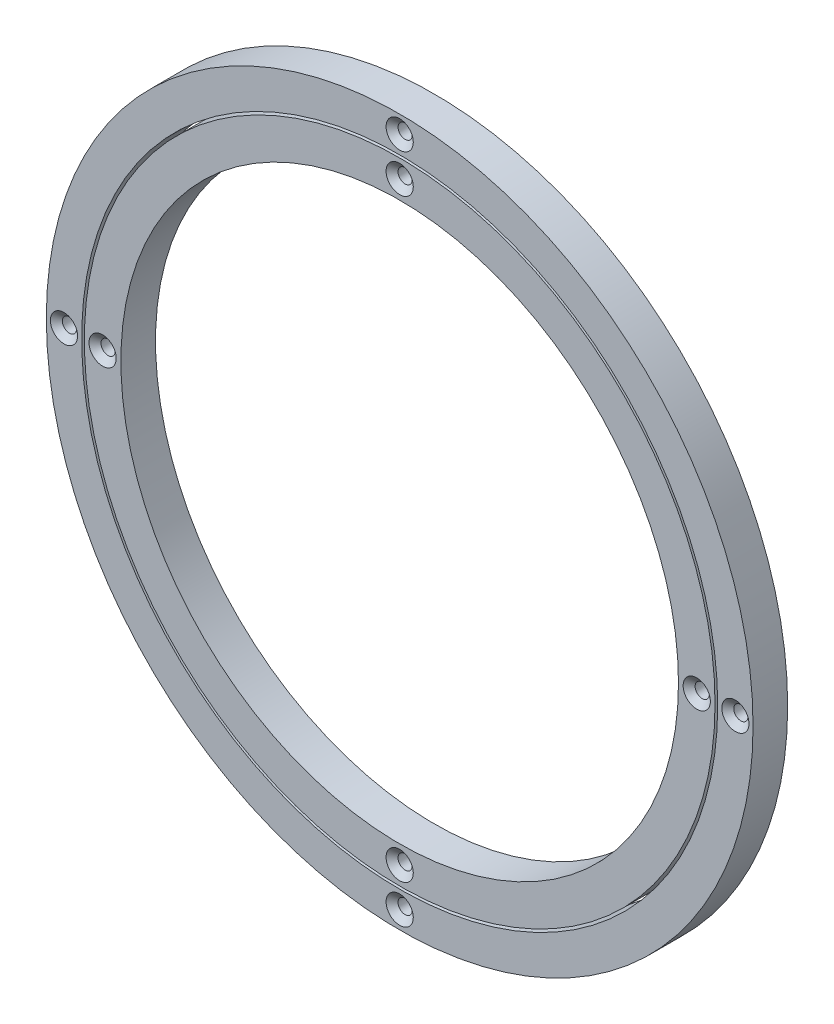
ISO-10303-21;
HEADER;
FILE_DESCRIPTION(('STEP AP214'),'2;1');
FILE_NAME('part.step','',(''),(''),'','','');
FILE_SCHEMA(('AUTOMOTIVE_DESIGN { 1 0 10303 214 1 1 1 1 }'));
ENDSEC;
DATA;
#1=APPLICATION_CONTEXT('core data for automotive mechanical design processes');
#2=APPLICATION_PROTOCOL_DEFINITION('international standard','automotive_design',2000,#1);
#3=PRODUCT_CONTEXT('',#1,'mechanical');
#4=PRODUCT('Part','Part','',(#3));
#5=PRODUCT_RELATED_PRODUCT_CATEGORY('part','',(#4));
#6=PRODUCT_DEFINITION_FORMATION('','',#4);
#7=PRODUCT_DEFINITION_CONTEXT('part definition',#1,'design');
#8=PRODUCT_DEFINITION('design','',#6,#7);
#9=PRODUCT_DEFINITION_SHAPE('','',#8);
#10=(LENGTH_UNIT() NAMED_UNIT(*) SI_UNIT(.MILLI.,.METRE.));
#11=(NAMED_UNIT(*) PLANE_ANGLE_UNIT() SI_UNIT($,.RADIAN.));
#12=(NAMED_UNIT(*) SI_UNIT($,.STERADIAN.) SOLID_ANGLE_UNIT());
#13=UNCERTAINTY_MEASURE_WITH_UNIT(LENGTH_MEASURE(1.E-05),#10,'distance_accuracy_value','');
#14=(GEOMETRIC_REPRESENTATION_CONTEXT(3) GLOBAL_UNCERTAINTY_ASSIGNED_CONTEXT((#13)) GLOBAL_UNIT_ASSIGNED_CONTEXT((#10,
#11,#12)) REPRESENTATION_CONTEXT('',''));
#15=CARTESIAN_POINT('',(0.,0.,0.));
#16=DIRECTION('',(0.,0.,1.));
#17=DIRECTION('',(1.,0.,0.));
#18=AXIS2_PLACEMENT_3D('',#15,#16,#17);
#19=CARTESIAN_POINT('',(0.,0.,12.446));
#20=DIRECTION('',(0.,0.,-1.));
#21=DIRECTION('',(-1.,0.,0.));
#22=AXIS2_PLACEMENT_3D('',#19,#20,#21);
#23=CYLINDRICAL_SURFACE('',#22,114.3);
#24=CARTESIAN_POINT('',(0.,0.,12.446));
#25=DIRECTION('',(0.,0.,1.));
#26=DIRECTION('',(1.,0.,0.));
#27=AXIS2_PLACEMENT_3D('',#24,#25,#26);
#28=CIRCLE('',#27,114.3);
#29=CARTESIAN_POINT('',(114.3,0.,12.446));
#30=VERTEX_POINT('',#29);
#31=EDGE_CURVE('E59',#30,#30,#28,.T.);
#32=ORIENTED_EDGE('',*,*,#31,.T.);
#33=EDGE_LOOP('',(#32));
#34=FACE_BOUND('',#33,.T.);
#35=CARTESIAN_POINT('',(0.,0.,0.));
#36=DIRECTION('',(0.,0.,1.));
#37=DIRECTION('',(1.,0.,0.));
#38=AXIS2_PLACEMENT_3D('',#35,#36,#37);
#39=CIRCLE('',#38,114.3);
#40=CARTESIAN_POINT('',(114.3,0.,0.));
#41=VERTEX_POINT('',#40);
#42=EDGE_CURVE('E67',#41,#41,#39,.T.);
#43=ORIENTED_EDGE('',*,*,#42,.F.);
#44=EDGE_LOOP('',(#43));
#45=FACE_BOUND('',#44,.T.);
#46=ADVANCED_FACE('F51',(#34,#45),#23,.F.);
#47=CARTESIAN_POINT('',(0.,0.,12.446));
#48=DIRECTION('',(0.,0.,-1.));
#49=DIRECTION('',(-1.,0.,0.));
#50=AXIS2_PLACEMENT_3D('',#47,#48,#49);
#51=CYLINDRICAL_SURFACE('',#50,127.);
#52=CARTESIAN_POINT('',(0.,0.,12.446));
#53=DIRECTION('',(0.,0.,1.));
#54=DIRECTION('',(1.,0.,0.));
#55=AXIS2_PLACEMENT_3D('',#52,#53,#54);
#56=CIRCLE('',#55,127.);
#57=CARTESIAN_POINT('',(127.,0.,12.446));
#58=VERTEX_POINT('',#57);
#59=EDGE_CURVE('E12',#58,#58,#56,.T.);
#60=ORIENTED_EDGE('',*,*,#59,.F.);
#61=EDGE_LOOP('',(#60));
#62=FACE_BOUND('',#61,.T.);
#63=CARTESIAN_POINT('',(0.,0.,0.));
#64=DIRECTION('',(0.,0.,1.));
#65=DIRECTION('',(1.,0.,0.));
#66=AXIS2_PLACEMENT_3D('',#63,#64,#65);
#67=CIRCLE('',#66,127.);
#68=CARTESIAN_POINT('',(127.,0.,0.));
#69=VERTEX_POINT('',#68);
#70=EDGE_CURVE('E54',#69,#69,#67,.T.);
#71=ORIENTED_EDGE('',*,*,#70,.T.);
#72=EDGE_LOOP('',(#71));
#73=FACE_BOUND('',#72,.T.);
#74=ADVANCED_FACE('F131',(#62,#73),#51,.T.);
#75=CARTESIAN_POINT('',(0.,0.,12.446));
#76=DIRECTION('',(0.,0.,1.));
#77=DIRECTION('',(1.,0.,0.));
#78=AXIS2_PLACEMENT_3D('',#75,#76,#77);
#79=PLANE('',#78);
#80=CARTESIAN_POINT('',(0.,-120.65,12.446));
#81=DIRECTION('',(0.,0.,1.));
#82=DIRECTION('',(1.,0.,0.));
#83=AXIS2_PLACEMENT_3D('',#80,#81,#82);
#84=CIRCLE('',#83,4.8895);
#85=CARTESIAN_POINT('',(4.8895,-120.65,12.446));
#86=VERTEX_POINT('',#85);
#87=EDGE_CURVE('E120',#86,#86,#84,.T.);
#88=ORIENTED_EDGE('',*,*,#87,.F.);
#89=EDGE_LOOP('',(#88));
#90=FACE_BOUND('',#89,.T.);
#91=CARTESIAN_POINT('',(-120.65,0.,12.446));
#92=DIRECTION('',(0.,0.,1.));
#93=DIRECTION('',(1.,0.,0.));
#94=AXIS2_PLACEMENT_3D('',#91,#92,#93);
#95=CIRCLE('',#94,4.88950000000001);
#96=CARTESIAN_POINT('',(-115.7605,0.,12.446));
#97=VERTEX_POINT('',#96);
#98=EDGE_CURVE('E108',#97,#97,#95,.T.);
#99=ORIENTED_EDGE('',*,*,#98,.F.);
#100=EDGE_LOOP('',(#99));
#101=FACE_BOUND('',#100,.T.);
#102=CARTESIAN_POINT('',(0.,120.65,12.446));
#103=DIRECTION('',(0.,0.,1.));
#104=DIRECTION('',(1.,0.,0.));
#105=AXIS2_PLACEMENT_3D('',#102,#103,#104);
#106=CIRCLE('',#105,4.8895);
#107=CARTESIAN_POINT('',(4.8895,120.65,12.446));
#108=VERTEX_POINT('',#107);
#109=EDGE_CURVE('E96',#108,#108,#106,.T.);
#110=ORIENTED_EDGE('',*,*,#109,.F.);
#111=EDGE_LOOP('',(#110));
#112=FACE_BOUND('',#111,.T.);
#113=CARTESIAN_POINT('',(120.65,0.,12.446));
#114=DIRECTION('',(0.,0.,1.));
#115=DIRECTION('',(1.,0.,0.));
#116=AXIS2_PLACEMENT_3D('',#113,#114,#115);
#117=CIRCLE('',#116,4.88949999999999);
#118=CARTESIAN_POINT('',(125.5395,0.,12.446));
#119=VERTEX_POINT('',#118);
#120=EDGE_CURVE('E82',#119,#119,#117,.T.);
#121=ORIENTED_EDGE('',*,*,#120,.F.);
#122=EDGE_LOOP('',(#121));
#123=FACE_BOUND('',#122,.T.);
#124=ORIENTED_EDGE('',*,*,#31,.F.);
#125=EDGE_LOOP('',(#124));
#126=FACE_BOUND('',#125,.T.);
#127=ORIENTED_EDGE('',*,*,#59,.T.);
#128=EDGE_LOOP('',(#127));
#129=FACE_BOUND('',#128,.T.);
#130=ADVANCED_FACE('F127',(#90,#101,#112,#123,#126,#129),#79,.T.);
#131=CARTESIAN_POINT('',(0.,0.,0.));
#132=DIRECTION('',(0.,0.,1.));
#133=DIRECTION('',(1.,0.,0.));
#134=AXIS2_PLACEMENT_3D('',#131,#132,#133);
#135=PLANE('',#134);
#136=CARTESIAN_POINT('',(0.,-120.65,0.));
#137=DIRECTION('',(0.,0.,1.));
#138=DIRECTION('',(1.,0.,0.));
#139=AXIS2_PLACEMENT_3D('',#136,#137,#138);
#140=CIRCLE('',#139,2.5527);
#141=CARTESIAN_POINT('',(2.5527,-120.65,0.));
#142=VERTEX_POINT('',#141);
#143=EDGE_CURVE('E112',#142,#142,#140,.T.);
#144=ORIENTED_EDGE('',*,*,#143,.T.);
#145=EDGE_LOOP('',(#144));
#146=FACE_BOUND('',#145,.T.);
#147=CARTESIAN_POINT('',(-120.65,0.,0.));
#148=DIRECTION('',(0.,0.,1.));
#149=DIRECTION('',(1.,0.,0.));
#150=AXIS2_PLACEMENT_3D('',#147,#148,#149);
#151=CIRCLE('',#150,2.55270000000001);
#152=CARTESIAN_POINT('',(-118.0973,0.,0.));
#153=VERTEX_POINT('',#152);
#154=EDGE_CURVE('E100',#153,#153,#151,.T.);
#155=ORIENTED_EDGE('',*,*,#154,.T.);
#156=EDGE_LOOP('',(#155));
#157=FACE_BOUND('',#156,.T.);
#158=CARTESIAN_POINT('',(0.,120.65,0.));
#159=DIRECTION('',(0.,0.,1.));
#160=DIRECTION('',(1.,0.,0.));
#161=AXIS2_PLACEMENT_3D('',#158,#159,#160);
#162=CIRCLE('',#161,2.5527);
#163=CARTESIAN_POINT('',(2.5527,120.65,0.));
#164=VERTEX_POINT('',#163);
#165=EDGE_CURVE('E88',#164,#164,#162,.T.);
#166=ORIENTED_EDGE('',*,*,#165,.T.);
#167=EDGE_LOOP('',(#166));
#168=FACE_BOUND('',#167,.T.);
#169=CARTESIAN_POINT('',(120.65,0.,0.));
#170=DIRECTION('',(0.,0.,1.));
#171=DIRECTION('',(1.,0.,0.));
#172=AXIS2_PLACEMENT_3D('',#169,#170,#171);
#173=CIRCLE('',#172,2.55270000000001);
#174=CARTESIAN_POINT('',(123.2027,0.,0.));
#175=VERTEX_POINT('',#174);
#176=EDGE_CURVE('E70',#175,#175,#173,.T.);
#177=ORIENTED_EDGE('',*,*,#176,.T.);
#178=EDGE_LOOP('',(#177));
#179=FACE_BOUND('',#178,.T.);
#180=ORIENTED_EDGE('',*,*,#42,.T.);
#181=EDGE_LOOP('',(#180));
#182=FACE_BOUND('',#181,.T.);
#183=ORIENTED_EDGE('',*,*,#70,.F.);
#184=EDGE_LOOP('',(#183));
#185=FACE_BOUND('',#184,.T.);
#186=ADVANCED_FACE('F130',(#146,#157,#168,#179,#182,#185),#135,.F.);
#187=CARTESIAN_POINT('',(120.65,0.,12.446));
#188=DIRECTION('',(0.,0.,1.));
#189=DIRECTION('',(1.,0.,0.));
#190=AXIS2_PLACEMENT_3D('',#187,#188,#189);
#191=CYLINDRICAL_SURFACE('',#190,2.5527);
#192=ORIENTED_EDGE('',*,*,#176,.F.);
#193=EDGE_LOOP('',(#192));
#194=FACE_BOUND('',#193,.T.);
#195=CARTESIAN_POINT('',(120.65,0.,10.4851919818649));
#196=DIRECTION('',(0.,0.,1.));
#197=DIRECTION('',(1.,0.,0.));
#198=AXIS2_PLACEMENT_3D('',#195,#196,#197);
#199=CIRCLE('',#198,2.55269999999999);
#200=CARTESIAN_POINT('',(123.2027,0.,10.4851919818649));
#201=VERTEX_POINT('',#200);
#202=EDGE_CURVE('E77',#201,#201,#199,.T.);
#203=ORIENTED_EDGE('',*,*,#202,.T.);
#204=EDGE_LOOP('',(#203));
#205=FACE_BOUND('',#204,.T.);
#206=ADVANCED_FACE('F152',(#194,#205),#191,.F.);
#207=CARTESIAN_POINT('',(120.65,0.,12.446));
#208=DIRECTION('',(0.,0.,1.));
#209=DIRECTION('',(1.,0.,0.));
#210=AXIS2_PLACEMENT_3D('',#207,#208,#209);
#211=CONICAL_SURFACE('',#210,4.88949999999999,0.872664625997164);
#212=ORIENTED_EDGE('',*,*,#202,.F.);
#213=EDGE_LOOP('',(#212));
#214=FACE_BOUND('',#213,.T.);
#215=ORIENTED_EDGE('',*,*,#120,.T.);
#216=EDGE_LOOP('',(#215));
#217=FACE_BOUND('',#216,.T.);
#218=ADVANCED_FACE('F157',(#214,#217),#211,.F.);
#219=CARTESIAN_POINT('',(0.,120.65,12.446));
#220=DIRECTION('',(0.,0.,1.));
#221=DIRECTION('',(1.,0.,0.));
#222=AXIS2_PLACEMENT_3D('',#219,#220,#221);
#223=CYLINDRICAL_SURFACE('',#222,2.55269999999999);
#224=ORIENTED_EDGE('',*,*,#165,.F.);
#225=EDGE_LOOP('',(#224));
#226=FACE_BOUND('',#225,.T.);
#227=CARTESIAN_POINT('',(0.,120.65,10.4851919818649));
#228=DIRECTION('',(0.,0.,1.));
#229=DIRECTION('',(1.,0.,0.));
#230=AXIS2_PLACEMENT_3D('',#227,#228,#229);
#231=CIRCLE('',#230,2.55269999999999);
#232=CARTESIAN_POINT('',(2.55269999999999,120.65,10.4851919818649));
#233=VERTEX_POINT('',#232);
#234=EDGE_CURVE('E92',#233,#233,#231,.T.);
#235=ORIENTED_EDGE('',*,*,#234,.T.);
#236=EDGE_LOOP('',(#235));
#237=FACE_BOUND('',#236,.T.);
#238=ADVANCED_FACE('F161',(#226,#237),#223,.F.);
#239=CARTESIAN_POINT('',(0.,120.65,12.446));
#240=DIRECTION('',(0.,0.,1.));
#241=DIRECTION('',(1.,0.,0.));
#242=AXIS2_PLACEMENT_3D('',#239,#240,#241);
#243=CONICAL_SURFACE('',#242,4.8895,0.872664625997166);
#244=ORIENTED_EDGE('',*,*,#234,.F.);
#245=EDGE_LOOP('',(#244));
#246=FACE_BOUND('',#245,.T.);
#247=ORIENTED_EDGE('',*,*,#109,.T.);
#248=EDGE_LOOP('',(#247));
#249=FACE_BOUND('',#248,.T.);
#250=ADVANCED_FACE('F165',(#246,#249),#243,.F.);
#251=CARTESIAN_POINT('',(-120.65,0.,12.446));
#252=DIRECTION('',(0.,0.,1.));
#253=DIRECTION('',(1.,0.,0.));
#254=AXIS2_PLACEMENT_3D('',#251,#252,#253);
#255=CYLINDRICAL_SURFACE('',#254,2.5527);
#256=ORIENTED_EDGE('',*,*,#154,.F.);
#257=EDGE_LOOP('',(#256));
#258=FACE_BOUND('',#257,.T.);
#259=CARTESIAN_POINT('',(-120.65,0.,10.4851919818649));
#260=DIRECTION('',(0.,0.,1.));
#261=DIRECTION('',(1.,0.,0.));
#262=AXIS2_PLACEMENT_3D('',#259,#260,#261);
#263=CIRCLE('',#262,2.55269999999999);
#264=CARTESIAN_POINT('',(-118.0973,0.,10.4851919818649));
#265=VERTEX_POINT('',#264);
#266=EDGE_CURVE('E104',#265,#265,#263,.T.);
#267=ORIENTED_EDGE('',*,*,#266,.T.);
#268=EDGE_LOOP('',(#267));
#269=FACE_BOUND('',#268,.T.);
#270=ADVANCED_FACE('F169',(#258,#269),#255,.F.);
#271=CARTESIAN_POINT('',(-120.65,0.,12.446));
#272=DIRECTION('',(0.,0.,1.));
#273=DIRECTION('',(1.,0.,0.));
#274=AXIS2_PLACEMENT_3D('',#271,#272,#273);
#275=CONICAL_SURFACE('',#274,4.88950000000001,0.872664625997166);
#276=ORIENTED_EDGE('',*,*,#266,.F.);
#277=EDGE_LOOP('',(#276));
#278=FACE_BOUND('',#277,.T.);
#279=ORIENTED_EDGE('',*,*,#98,.T.);
#280=EDGE_LOOP('',(#279));
#281=FACE_BOUND('',#280,.T.);
#282=ADVANCED_FACE('F173',(#278,#281),#275,.F.);
#283=CARTESIAN_POINT('',(0.,-120.65,12.446));
#284=DIRECTION('',(0.,0.,1.));
#285=DIRECTION('',(1.,0.,0.));
#286=AXIS2_PLACEMENT_3D('',#283,#284,#285);
#287=CYLINDRICAL_SURFACE('',#286,2.55269999999999);
#288=ORIENTED_EDGE('',*,*,#143,.F.);
#289=EDGE_LOOP('',(#288));
#290=FACE_BOUND('',#289,.T.);
#291=CARTESIAN_POINT('',(0.,-120.65,10.4851919818649));
#292=DIRECTION('',(0.,0.,1.));
#293=DIRECTION('',(1.,0.,0.));
#294=AXIS2_PLACEMENT_3D('',#291,#292,#293);
#295=CIRCLE('',#294,2.55269999999999);
#296=CARTESIAN_POINT('',(2.55269999999999,-120.65,10.4851919818649));
#297=VERTEX_POINT('',#296);
#298=EDGE_CURVE('E116',#297,#297,#295,.T.);
#299=ORIENTED_EDGE('',*,*,#298,.T.);
#300=EDGE_LOOP('',(#299));
#301=FACE_BOUND('',#300,.T.);
#302=ADVANCED_FACE('F177',(#290,#301),#287,.F.);
#303=CARTESIAN_POINT('',(0.,-120.65,12.446));
#304=DIRECTION('',(0.,0.,1.));
#305=DIRECTION('',(1.,0.,0.));
#306=AXIS2_PLACEMENT_3D('',#303,#304,#305);
#307=CONICAL_SURFACE('',#306,4.8895,0.872664625997166);
#308=ORIENTED_EDGE('',*,*,#298,.F.);
#309=EDGE_LOOP('',(#308));
#310=FACE_BOUND('',#309,.T.);
#311=ORIENTED_EDGE('',*,*,#87,.T.);
#312=EDGE_LOOP('',(#311));
#313=FACE_BOUND('',#312,.T.);
#314=ADVANCED_FACE('F125',(#310,#313),#307,.F.);
#315=CLOSED_SHELL('',(#46,#74,#130,#186,#206,#218,#238,#250,#270,#282,#302,#314));
#316=MANIFOLD_SOLID_BREP('B2',#315);
#317=CARTESIAN_POINT('',(0.,0.,12.446));
#318=DIRECTION('',(0.,0.,-1.));
#319=DIRECTION('',(-1.,0.,0.));
#320=AXIS2_PLACEMENT_3D('',#317,#318,#319);
#321=CYLINDRICAL_SURFACE('',#320,100.203);
#322=CARTESIAN_POINT('',(0.,0.,12.446));
#323=DIRECTION('',(0.,0.,1.));
#324=DIRECTION('',(1.,0.,0.));
#325=AXIS2_PLACEMENT_3D('',#322,#323,#324);
#326=CIRCLE('',#325,100.203);
#327=CARTESIAN_POINT('',(100.203,0.,12.446));
#328=VERTEX_POINT('',#327);
#329=EDGE_CURVE('E281',#328,#328,#326,.T.);
#330=ORIENTED_EDGE('',*,*,#329,.T.);
#331=EDGE_LOOP('',(#330));
#332=FACE_BOUND('',#331,.T.);
#333=CARTESIAN_POINT('',(0.,0.,0.));
#334=DIRECTION('',(0.,0.,1.));
#335=DIRECTION('',(1.,0.,0.));
#336=AXIS2_PLACEMENT_3D('',#333,#334,#335);
#337=CIRCLE('',#336,100.203);
#338=CARTESIAN_POINT('',(100.203,0.,0.));
#339=VERTEX_POINT('',#338);
#340=EDGE_CURVE('E290',#339,#339,#337,.T.);
#341=ORIENTED_EDGE('',*,*,#340,.F.);
#342=EDGE_LOOP('',(#341));
#343=FACE_BOUND('',#342,.T.);
#344=ADVANCED_FACE('F273',(#332,#343),#321,.F.);
#345=CARTESIAN_POINT('',(0.,0.,12.446));
#346=DIRECTION('',(0.,0.,-1.));
#347=DIRECTION('',(-1.,0.,0.));
#348=AXIS2_PLACEMENT_3D('',#345,#346,#347);
#349=CYLINDRICAL_SURFACE('',#348,113.3348);
#350=CARTESIAN_POINT('',(0.,0.,12.446));
#351=DIRECTION('',(0.,0.,1.));
#352=DIRECTION('',(1.,0.,0.));
#353=AXIS2_PLACEMENT_3D('',#350,#351,#352);
#354=CIRCLE('',#353,113.3348);
#355=CARTESIAN_POINT('',(113.3348,0.,12.446));
#356=VERTEX_POINT('',#355);
#357=EDGE_CURVE('E50',#356,#356,#354,.T.);
#358=ORIENTED_EDGE('',*,*,#357,.F.);
#359=EDGE_LOOP('',(#358));
#360=FACE_BOUND('',#359,.T.);
#361=CARTESIAN_POINT('',(0.,0.,0.));
#362=DIRECTION('',(0.,0.,1.));
#363=DIRECTION('',(1.,0.,0.));
#364=AXIS2_PLACEMENT_3D('',#361,#362,#363);
#365=CIRCLE('',#364,113.3348);
#366=CARTESIAN_POINT('',(113.3348,0.,0.));
#367=VERTEX_POINT('',#366);
#368=EDGE_CURVE('E276',#367,#367,#365,.T.);
#369=ORIENTED_EDGE('',*,*,#368,.T.);
#370=EDGE_LOOP('',(#369));
#371=FACE_BOUND('',#370,.T.);
#372=ADVANCED_FACE('F341',(#360,#371),#349,.T.);
#373=CARTESIAN_POINT('',(0.,0.,12.446));
#374=DIRECTION('',(0.,0.,1.));
#375=DIRECTION('',(1.,0.,0.));
#376=AXIS2_PLACEMENT_3D('',#373,#374,#375);
#377=PLANE('',#376);
#378=CARTESIAN_POINT('',(0.,-106.7689,12.446));
#379=DIRECTION('',(0.,0.,1.));
#380=DIRECTION('',(1.,0.,0.));
#381=AXIS2_PLACEMENT_3D('',#378,#379,#380);
#382=CIRCLE('',#381,4.8895);
#383=CARTESIAN_POINT('',(4.8895,-106.7689,12.446));
#384=VERTEX_POINT('',#383);
#385=EDGE_CURVE('E331',#384,#384,#382,.T.);
#386=ORIENTED_EDGE('',*,*,#385,.F.);
#387=EDGE_LOOP('',(#386));
#388=FACE_BOUND('',#387,.T.);
#389=CARTESIAN_POINT('',(0.,106.7689,12.446));
#390=DIRECTION('',(0.,0.,1.));
#391=DIRECTION('',(1.,0.,0.));
#392=AXIS2_PLACEMENT_3D('',#389,#390,#391);
#393=CIRCLE('',#392,4.8895);
#394=CARTESIAN_POINT('',(4.8895,106.7689,12.446));
#395=VERTEX_POINT('',#394);
#396=EDGE_CURVE('E322',#395,#395,#393,.T.);
#397=ORIENTED_EDGE('',*,*,#396,.F.);
#398=EDGE_LOOP('',(#397));
#399=FACE_BOUND('',#398,.T.);
#400=CARTESIAN_POINT('',(106.7689,0.,12.446));
#401=DIRECTION('',(0.,0.,1.));
#402=DIRECTION('',(1.,0.,0.));
#403=AXIS2_PLACEMENT_3D('',#400,#401,#402);
#404=CIRCLE('',#403,4.88950000000001);
#405=CARTESIAN_POINT('',(111.6584,0.,12.446));
#406=VERTEX_POINT('',#405);
#407=EDGE_CURVE('E313',#406,#406,#404,.T.);
#408=ORIENTED_EDGE('',*,*,#407,.F.);
#409=EDGE_LOOP('',(#408));
#410=FACE_BOUND('',#409,.T.);
#411=CARTESIAN_POINT('',(-106.7689,0.,12.446));
#412=DIRECTION('',(0.,0.,1.));
#413=DIRECTION('',(1.,0.,0.));
#414=AXIS2_PLACEMENT_3D('',#411,#412,#413);
#415=CIRCLE('',#414,4.88950000000001);
#416=CARTESIAN_POINT('',(-101.8794,0.,12.446));
#417=VERTEX_POINT('',#416);
#418=EDGE_CURVE('E302',#417,#417,#415,.T.);
#419=ORIENTED_EDGE('',*,*,#418,.F.);
#420=EDGE_LOOP('',(#419));
#421=FACE_BOUND('',#420,.T.);
#422=ORIENTED_EDGE('',*,*,#329,.F.);
#423=EDGE_LOOP('',(#422));
#424=FACE_BOUND('',#423,.T.);
#425=ORIENTED_EDGE('',*,*,#357,.T.);
#426=EDGE_LOOP('',(#425));
#427=FACE_BOUND('',#426,.T.);
#428=ADVANCED_FACE('F337',(#388,#399,#410,#421,#424,#427),#377,.T.);
#429=CARTESIAN_POINT('',(0.,0.,0.));
#430=DIRECTION('',(0.,0.,1.));
#431=DIRECTION('',(1.,0.,0.));
#432=AXIS2_PLACEMENT_3D('',#429,#430,#431);
#433=PLANE('',#432);
#434=CARTESIAN_POINT('',(0.,-106.7689,0.));
#435=DIRECTION('',(0.,0.,1.));
#436=DIRECTION('',(1.,0.,0.));
#437=AXIS2_PLACEMENT_3D('',#434,#435,#436);
#438=CIRCLE('',#437,2.5527);
#439=CARTESIAN_POINT('',(2.5527,-106.7689,0.));
#440=VERTEX_POINT('',#439);
#441=EDGE_CURVE('E325',#440,#440,#438,.T.);
#442=ORIENTED_EDGE('',*,*,#441,.T.);
#443=EDGE_LOOP('',(#442));
#444=FACE_BOUND('',#443,.T.);
#445=CARTESIAN_POINT('',(0.,106.7689,0.));
#446=DIRECTION('',(0.,0.,1.));
#447=DIRECTION('',(1.,0.,0.));
#448=AXIS2_PLACEMENT_3D('',#445,#446,#447);
#449=CIRCLE('',#448,2.5527);
#450=CARTESIAN_POINT('',(2.5527,106.7689,0.));
#451=VERTEX_POINT('',#450);
#452=EDGE_CURVE('E316',#451,#451,#449,.T.);
#453=ORIENTED_EDGE('',*,*,#452,.T.);
#454=EDGE_LOOP('',(#453));
#455=FACE_BOUND('',#454,.T.);
#456=CARTESIAN_POINT('',(106.7689,0.,0.));
#457=DIRECTION('',(0.,0.,1.));
#458=DIRECTION('',(1.,0.,0.));
#459=AXIS2_PLACEMENT_3D('',#456,#457,#458);
#460=CIRCLE('',#459,2.55270000000001);
#461=CARTESIAN_POINT('',(109.3216,0.,0.));
#462=VERTEX_POINT('',#461);
#463=EDGE_CURVE('E307',#462,#462,#460,.T.);
#464=ORIENTED_EDGE('',*,*,#463,.T.);
#465=EDGE_LOOP('',(#464));
#466=FACE_BOUND('',#465,.T.);
#467=CARTESIAN_POINT('',(-106.7689,0.,0.));
#468=DIRECTION('',(0.,0.,1.));
#469=DIRECTION('',(1.,0.,0.));
#470=AXIS2_PLACEMENT_3D('',#467,#468,#469);
#471=CIRCLE('',#470,2.55270000000001);
#472=CARTESIAN_POINT('',(-104.2162,0.,0.));
#473=VERTEX_POINT('',#472);
#474=EDGE_CURVE('E293',#473,#473,#471,.T.);
#475=ORIENTED_EDGE('',*,*,#474,.T.);
#476=EDGE_LOOP('',(#475));
#477=FACE_BOUND('',#476,.T.);
#478=ORIENTED_EDGE('',*,*,#340,.T.);
#479=EDGE_LOOP('',(#478));
#480=FACE_BOUND('',#479,.T.);
#481=ORIENTED_EDGE('',*,*,#368,.F.);
#482=EDGE_LOOP('',(#481));
#483=FACE_BOUND('',#482,.T.);
#484=ADVANCED_FACE('F340',(#444,#455,#466,#477,#480,#483),#433,.F.);
#485=CARTESIAN_POINT('',(-106.7689,0.,12.446));
#486=DIRECTION('',(0.,0.,1.));
#487=DIRECTION('',(1.,0.,0.));
#488=AXIS2_PLACEMENT_3D('',#485,#486,#487);
#489=CYLINDRICAL_SURFACE('',#488,2.5527);
#490=ORIENTED_EDGE('',*,*,#474,.F.);
#491=EDGE_LOOP('',(#490));
#492=FACE_BOUND('',#491,.T.);
#493=CARTESIAN_POINT('',(-106.7689,0.,10.4851919818649));
#494=DIRECTION('',(0.,0.,1.));
#495=DIRECTION('',(1.,0.,0.));
#496=AXIS2_PLACEMENT_3D('',#493,#494,#495);
#497=CIRCLE('',#496,2.55269999999999);
#498=CARTESIAN_POINT('',(-104.2162,0.,10.4851919818649));
#499=VERTEX_POINT('',#498);
#500=EDGE_CURVE('E298',#499,#499,#497,.T.);
#501=ORIENTED_EDGE('',*,*,#500,.T.);
#502=EDGE_LOOP('',(#501));
#503=FACE_BOUND('',#502,.T.);
#504=ADVANCED_FACE('F362',(#492,#503),#489,.F.);
#505=CARTESIAN_POINT('',(-106.7689,0.,12.446));
#506=DIRECTION('',(0.,0.,1.));
#507=DIRECTION('',(1.,0.,0.));
#508=AXIS2_PLACEMENT_3D('',#505,#506,#507);
#509=CONICAL_SURFACE('',#508,4.88950000000001,0.872664625997166);
#510=ORIENTED_EDGE('',*,*,#500,.F.);
#511=EDGE_LOOP('',(#510));
#512=FACE_BOUND('',#511,.T.);
#513=ORIENTED_EDGE('',*,*,#418,.T.);
#514=EDGE_LOOP('',(#513));
#515=FACE_BOUND('',#514,.T.);
#516=ADVANCED_FACE('F367',(#512,#515),#509,.F.);
#517=CARTESIAN_POINT('',(106.7689,0.,12.446));
#518=DIRECTION('',(0.,0.,1.));
#519=DIRECTION('',(1.,0.,0.));
#520=AXIS2_PLACEMENT_3D('',#517,#518,#519);
#521=CYLINDRICAL_SURFACE('',#520,2.5527);
#522=ORIENTED_EDGE('',*,*,#463,.F.);
#523=EDGE_LOOP('',(#522));
#524=FACE_BOUND('',#523,.T.);
#525=CARTESIAN_POINT('',(106.7689,0.,10.4851919818649));
#526=DIRECTION('',(0.,0.,1.));
#527=DIRECTION('',(1.,0.,0.));
#528=AXIS2_PLACEMENT_3D('',#525,#526,#527);
#529=CIRCLE('',#528,2.55269999999999);
#530=CARTESIAN_POINT('',(109.3216,0.,10.4851919818649));
#531=VERTEX_POINT('',#530);
#532=EDGE_CURVE('E310',#531,#531,#529,.T.);
#533=ORIENTED_EDGE('',*,*,#532,.T.);
#534=EDGE_LOOP('',(#533));
#535=FACE_BOUND('',#534,.T.);
#536=ADVANCED_FACE('F371',(#524,#535),#521,.F.);
#537=CARTESIAN_POINT('',(106.7689,0.,12.446));
#538=DIRECTION('',(0.,0.,1.));
#539=DIRECTION('',(1.,0.,0.));
#540=AXIS2_PLACEMENT_3D('',#537,#538,#539);
#541=CONICAL_SURFACE('',#540,4.88950000000001,0.872664625997166);
#542=ORIENTED_EDGE('',*,*,#532,.F.);
#543=EDGE_LOOP('',(#542));
#544=FACE_BOUND('',#543,.T.);
#545=ORIENTED_EDGE('',*,*,#407,.T.);
#546=EDGE_LOOP('',(#545));
#547=FACE_BOUND('',#546,.T.);
#548=ADVANCED_FACE('F375',(#544,#547),#541,.F.);
#549=CARTESIAN_POINT('',(0.,106.7689,12.446));
#550=DIRECTION('',(0.,0.,1.));
#551=DIRECTION('',(1.,0.,0.));
#552=AXIS2_PLACEMENT_3D('',#549,#550,#551);
#553=CYLINDRICAL_SURFACE('',#552,2.55269999999999);
#554=ORIENTED_EDGE('',*,*,#452,.F.);
#555=EDGE_LOOP('',(#554));
#556=FACE_BOUND('',#555,.T.);
#557=CARTESIAN_POINT('',(0.,106.7689,10.4851919818649));
#558=DIRECTION('',(0.,0.,1.));
#559=DIRECTION('',(1.,0.,0.));
#560=AXIS2_PLACEMENT_3D('',#557,#558,#559);
#561=CIRCLE('',#560,2.55269999999999);
#562=CARTESIAN_POINT('',(2.55269999999999,106.7689,10.4851919818649));
#563=VERTEX_POINT('',#562);
#564=EDGE_CURVE('E319',#563,#563,#561,.T.);
#565=ORIENTED_EDGE('',*,*,#564,.T.);
#566=EDGE_LOOP('',(#565));
#567=FACE_BOUND('',#566,.T.);
#568=ADVANCED_FACE('F379',(#556,#567),#553,.F.);
#569=CARTESIAN_POINT('',(0.,106.7689,12.446));
#570=DIRECTION('',(0.,0.,1.));
#571=DIRECTION('',(1.,0.,0.));
#572=AXIS2_PLACEMENT_3D('',#569,#570,#571);
#573=CONICAL_SURFACE('',#572,4.8895,0.872664625997166);
#574=ORIENTED_EDGE('',*,*,#564,.F.);
#575=EDGE_LOOP('',(#574));
#576=FACE_BOUND('',#575,.T.);
#577=ORIENTED_EDGE('',*,*,#396,.T.);
#578=EDGE_LOOP('',(#577));
#579=FACE_BOUND('',#578,.T.);
#580=ADVANCED_FACE('F383',(#576,#579),#573,.F.);
#581=CARTESIAN_POINT('',(0.,-106.7689,12.446));
#582=DIRECTION('',(0.,0.,1.));
#583=DIRECTION('',(1.,0.,0.));
#584=AXIS2_PLACEMENT_3D('',#581,#582,#583);
#585=CYLINDRICAL_SURFACE('',#584,2.55269999999999);
#586=ORIENTED_EDGE('',*,*,#441,.F.);
#587=EDGE_LOOP('',(#586));
#588=FACE_BOUND('',#587,.T.);
#589=CARTESIAN_POINT('',(0.,-106.7689,10.4851919818649));
#590=DIRECTION('',(0.,0.,1.));
#591=DIRECTION('',(1.,0.,0.));
#592=AXIS2_PLACEMENT_3D('',#589,#590,#591);
#593=CIRCLE('',#592,2.55269999999999);
#594=CARTESIAN_POINT('',(2.55269999999999,-106.7689,10.4851919818649));
#595=VERTEX_POINT('',#594);
#596=EDGE_CURVE('E328',#595,#595,#593,.T.);
#597=ORIENTED_EDGE('',*,*,#596,.T.);
#598=EDGE_LOOP('',(#597));
#599=FACE_BOUND('',#598,.T.);
#600=ADVANCED_FACE('F387',(#588,#599),#585,.F.);
#601=CARTESIAN_POINT('',(0.,-106.7689,12.446));
#602=DIRECTION('',(0.,0.,1.));
#603=DIRECTION('',(1.,0.,0.));
#604=AXIS2_PLACEMENT_3D('',#601,#602,#603);
#605=CONICAL_SURFACE('',#604,4.8895,0.872664625997166);
#606=ORIENTED_EDGE('',*,*,#596,.F.);
#607=EDGE_LOOP('',(#606));
#608=FACE_BOUND('',#607,.T.);
#609=ORIENTED_EDGE('',*,*,#385,.T.);
#610=EDGE_LOOP('',(#609));
#611=FACE_BOUND('',#610,.T.);
#612=ADVANCED_FACE('F335',(#608,#611),#605,.F.);
#613=CLOSED_SHELL('',(#344,#372,#428,#484,#504,#516,#536,#548,#568,#580,#600,#612));
#614=MANIFOLD_SOLID_BREP('B7',#613);
#615=ADVANCED_BREP_SHAPE_REPRESENTATION('',(#18,#316,#614),#14);
#616=SHAPE_DEFINITION_REPRESENTATION(#9,#615);
ENDSEC;
END-ISO-10303-21;
